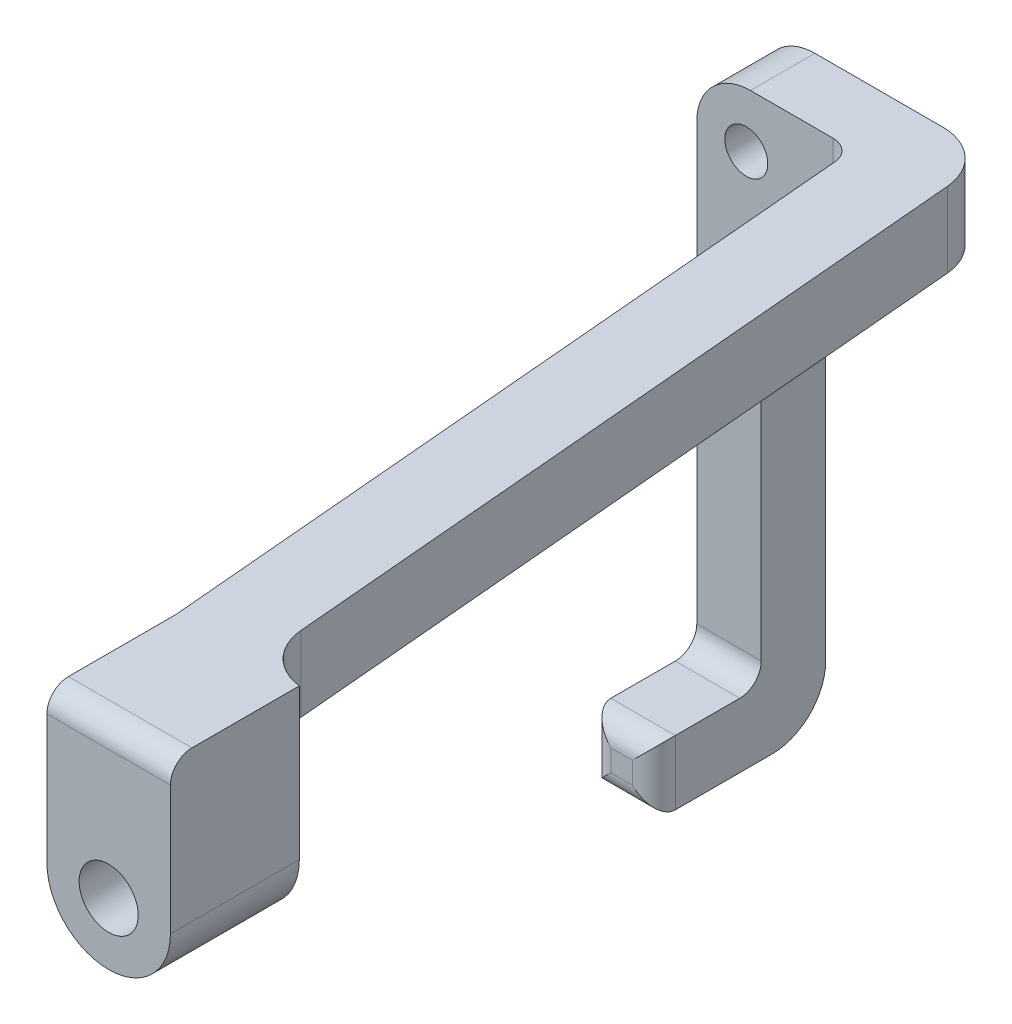
ISO-10303-21;
HEADER;
FILE_DESCRIPTION(('STEP AP214'),'2;1');
FILE_NAME('part.step','',(''),(''),'','','');
FILE_SCHEMA(('AUTOMOTIVE_DESIGN { 1 0 10303 214 1 1 1 1 }'));
ENDSEC;
DATA;
#1=APPLICATION_CONTEXT('core data for automotive mechanical design processes');
#2=APPLICATION_PROTOCOL_DEFINITION('international standard','automotive_design',2000,#1);
#3=PRODUCT_CONTEXT('',#1,'mechanical');
#4=PRODUCT('Part','Part','',(#3));
#5=PRODUCT_RELATED_PRODUCT_CATEGORY('part','',(#4));
#6=PRODUCT_DEFINITION_FORMATION('','',#4);
#7=PRODUCT_DEFINITION_CONTEXT('part definition',#1,'design');
#8=PRODUCT_DEFINITION('design','',#6,#7);
#9=PRODUCT_DEFINITION_SHAPE('','',#8);
#10=(LENGTH_UNIT() NAMED_UNIT(*) SI_UNIT(.MILLI.,.METRE.));
#11=(NAMED_UNIT(*) PLANE_ANGLE_UNIT() SI_UNIT($,.RADIAN.));
#12=(NAMED_UNIT(*) SI_UNIT($,.STERADIAN.) SOLID_ANGLE_UNIT());
#13=UNCERTAINTY_MEASURE_WITH_UNIT(LENGTH_MEASURE(1.E-05),#10,'distance_accuracy_value','');
#14=(GEOMETRIC_REPRESENTATION_CONTEXT(3) GLOBAL_UNCERTAINTY_ASSIGNED_CONTEXT((#13)) GLOBAL_UNIT_ASSIGNED_CONTEXT((#10,
#11,#12)) REPRESENTATION_CONTEXT('',''));
#15=CARTESIAN_POINT('',(0.,0.,0.));
#16=DIRECTION('',(0.,0.,1.));
#17=DIRECTION('',(1.,0.,0.));
#18=AXIS2_PLACEMENT_3D('',#15,#16,#17);
#19=CARTESIAN_POINT('',(-1.37658783702771,7.,-34.5));
#20=DIRECTION('',(0.,0.,-1.));
#21=DIRECTION('',(-1.,0.,0.));
#22=AXIS2_PLACEMENT_3D('',#19,#20,#21);
#23=PLANE('',#22);
#24=CARTESIAN_POINT('',(-10.819543648263,4.44454364826301,-34.5));
#25=DIRECTION('',(0.,0.,-1.));
#26=DIRECTION('',(-1.,0.,0.));
#27=AXIS2_PLACEMENT_3D('',#24,#25,#26);
#28=CIRCLE('',#27,1.);
#29=CARTESIAN_POINT('',(-11.819543648263,4.44454364826301,-34.5));
#30=VERTEX_POINT('',#29);
#31=EDGE_CURVE('E391',#30,#30,#28,.F.);
#32=ORIENTED_EDGE('',*,*,#31,.F.);
#33=EDGE_LOOP('',(#32));
#34=FACE_BOUND('',#33,.T.);
#35=DIRECTION('',(-1.,0.,0.));
#36=VECTOR('',#35,1.);
#37=CARTESIAN_POINT('',(-1.37658783702771,3.5,-34.5));
#38=LINE('',#37,#36);
#39=CARTESIAN_POINT('',(-6.78208186315099,3.5,-34.5));
#40=VERTEX_POINT('',#39);
#41=CARTESIAN_POINT('',(-7.125,3.5,-34.5));
#42=VERTEX_POINT('',#41);
#43=EDGE_CURVE('E216',#40,#42,#38,.T.);
#44=ORIENTED_EDGE('',*,*,#43,.F.);
#45=DIRECTION('',(0.,-1.,0.));
#46=VECTOR('',#45,1.);
#47=CARTESIAN_POINT('',(-6.78208186315099,7.,-34.5));
#48=LINE('',#47,#46);
#49=CARTESIAN_POINT('',(-6.78208186315099,7.,-34.5));
#50=VERTEX_POINT('',#49);
#51=EDGE_CURVE('E394',#40,#50,#48,.F.);
#52=ORIENTED_EDGE('',*,*,#51,.T.);
#53=DIRECTION('',(-1.,0.,0.));
#54=VECTOR('',#53,1.);
#55=CARTESIAN_POINT('',(-1.37658783702771,7.,-34.5));
#56=LINE('',#55,#54);
#57=CARTESIAN_POINT('',(-10.625,7.,-34.5));
#58=VERTEX_POINT('',#57);
#59=EDGE_CURVE('E397',#50,#58,#56,.T.);
#60=ORIENTED_EDGE('',*,*,#59,.T.);
#61=CARTESIAN_POINT('',(-10.625,4.5,-34.5));
#62=DIRECTION('',(0.,0.,-1.));
#63=DIRECTION('',(-1.,0.,0.));
#64=AXIS2_PLACEMENT_3D('',#61,#62,#63);
#65=CIRCLE('',#64,2.5);
#66=CARTESIAN_POINT('',(-13.125,4.5,-34.5));
#67=VERTEX_POINT('',#66);
#68=EDGE_CURVE('E315',#58,#67,#65,.F.);
#69=ORIENTED_EDGE('',*,*,#68,.T.);
#70=DIRECTION('',(0.,-1.,0.));
#71=VECTOR('',#70,1.);
#72=CARTESIAN_POINT('',(-13.125,7.,-34.5));
#73=LINE('',#72,#71);
#74=CARTESIAN_POINT('',(-13.125,-15.75,-34.5));
#75=VERTEX_POINT('',#74);
#76=EDGE_CURVE('E305',#67,#75,#73,.T.);
#77=ORIENTED_EDGE('',*,*,#76,.T.);
#78=DIRECTION('',(-1.,0.,0.));
#79=VECTOR('',#78,1.);
#80=CARTESIAN_POINT('',(-10.125,-15.75,-34.5));
#81=LINE('',#80,#79);
#82=CARTESIAN_POINT('',(-10.125,-15.75,-34.5));
#83=VERTEX_POINT('',#82);
#84=EDGE_CURVE('E406',#75,#83,#81,.F.);
#85=ORIENTED_EDGE('',*,*,#84,.T.);
#86=DIRECTION('',(0.,1.,0.));
#87=VECTOR('',#86,1.);
#88=CARTESIAN_POINT('',(-10.125,-19.75,-34.5));
#89=LINE('',#88,#87);
#90=CARTESIAN_POINT('',(-10.125,0.499999999999994,-34.5));
#91=VERTEX_POINT('',#90);
#92=EDGE_CURVE('E458',#83,#91,#89,.T.);
#93=ORIENTED_EDGE('',*,*,#92,.T.);
#94=CARTESIAN_POINT('',(-7.125,0.500000000000002,-34.5));
#95=DIRECTION('',(0.,0.,-1.));
#96=DIRECTION('',(-1.,0.,0.));
#97=AXIS2_PLACEMENT_3D('',#94,#95,#96);
#98=CIRCLE('',#97,3.);
#99=EDGE_CURVE('E12',#91,#42,#98,.T.);
#100=ORIENTED_EDGE('',*,*,#99,.T.);
#101=EDGE_LOOP('',(#44,#52,#60,#69,#77,#85,#93,#100));
#102=FACE_BOUND('',#101,.T.);
#103=ADVANCED_FACE('F47',(#34,#102),#23,.F.);
#104=CARTESIAN_POINT('',(-2.85356654462041,0.,0.247309100533769));
#105=DIRECTION('',(0.996265469182466,0.,-0.0863430073291471));
#106=DIRECTION('',(-0.0863430073291471,0.,-0.996265469182466));
#107=AXIS2_PLACEMENT_3D('',#104,#105,#106);
#108=PLANE('',#107);
#109=DIRECTION('',(-0.0863430073291471,0.,-0.996265469182466));
#110=VECTOR('',#109,1.);
#111=CARTESIAN_POINT('',(-2.875,7.,0.));
#112=LINE('',#111,#110);
#113=CARTESIAN_POINT('',(-2.875,7.,0.));
#114=VERTEX_POINT('',#113);
#115=CARTESIAN_POINT('',(-5.78581639396853,7.,-33.5863430073291));
#116=VERTEX_POINT('',#115);
#117=EDGE_CURVE('E341',#114,#116,#112,.T.);
#118=ORIENTED_EDGE('',*,*,#117,.T.);
#119=DIRECTION('',(0.,-1.,0.));
#120=VECTOR('',#119,1.);
#121=CARTESIAN_POINT('',(-5.78581639396853,3.5,-33.5863430073291));
#122=LINE('',#121,#120);
#123=CARTESIAN_POINT('',(-5.78581639396853,3.5,-33.5863430073291));
#124=VERTEX_POINT('',#123);
#125=EDGE_CURVE('E411',#116,#124,#122,.T.);
#126=ORIENTED_EDGE('',*,*,#125,.T.);
#127=DIRECTION('',(-0.086343007329147,0.,-0.996265469182466));
#128=VECTOR('',#127,1.);
#129=CARTESIAN_POINT('',(-2.875,3.5,0.));
#130=LINE('',#129,#128);
#131=CARTESIAN_POINT('',(-2.875,3.5,0.));
#132=VERTEX_POINT('',#131);
#133=EDGE_CURVE('E342',#132,#124,#130,.T.);
#134=ORIENTED_EDGE('',*,*,#133,.F.);
#135=DIRECTION('',(0.,1.,0.));
#136=VECTOR('',#135,1.);
#137=CARTESIAN_POINT('',(-2.875,0.,0.));
#138=LINE('',#137,#136);
#139=EDGE_CURVE('E289',#114,#132,#138,.F.);
#140=ORIENTED_EDGE('',*,*,#139,.F.);
#141=EDGE_LOOP('',(#118,#126,#134,#140));
#142=FACE_BOUND('',#141,.T.);
#143=ADVANCED_FACE('F256',(#142),#108,.F.);
#144=CARTESIAN_POINT('',(0.,0.,6.));
#145=DIRECTION('',(0.,0.,1.));
#146=DIRECTION('',(1.,0.,0.));
#147=AXIS2_PLACEMENT_3D('',#144,#145,#146);
#148=PLANE('',#147);
#149=DIRECTION('',(0.,1.,0.));
#150=VECTOR('',#149,1.);
#151=CARTESIAN_POINT('',(2.875,0.,6.));
#152=LINE('',#151,#150);
#153=CARTESIAN_POINT('',(2.875,0.,6.));
#154=VERTEX_POINT('',#153);
#155=CARTESIAN_POINT('',(2.875,6.,6.));
#156=VERTEX_POINT('',#155);
#157=EDGE_CURVE('E491',#154,#156,#152,.T.);
#158=ORIENTED_EDGE('',*,*,#157,.T.);
#159=DIRECTION('',(-1.,0.,0.));
#160=VECTOR('',#159,1.);
#161=CARTESIAN_POINT('',(-2.875,6.,6.));
#162=LINE('',#161,#160);
#163=CARTESIAN_POINT('',(-2.875,6.,6.));
#164=VERTEX_POINT('',#163);
#165=EDGE_CURVE('E405',#156,#164,#162,.T.);
#166=ORIENTED_EDGE('',*,*,#165,.T.);
#167=DIRECTION('',(0.,-1.,0.));
#168=VECTOR('',#167,1.);
#169=CARTESIAN_POINT('',(-2.875,0.,6.));
#170=LINE('',#169,#168);
#171=CARTESIAN_POINT('',(-2.875,0.,6.));
#172=VERTEX_POINT('',#171);
#173=EDGE_CURVE('E481',#164,#172,#170,.T.);
#174=ORIENTED_EDGE('',*,*,#173,.T.);
#175=CARTESIAN_POINT('',(0.,0.,6.));
#176=DIRECTION('',(0.,0.,1.));
#177=DIRECTION('',(1.,0.,0.));
#178=AXIS2_PLACEMENT_3D('',#175,#176,#177);
#179=CIRCLE('',#178,2.875);
#180=EDGE_CURVE('E297',#172,#154,#179,.T.);
#181=ORIENTED_EDGE('',*,*,#180,.T.);
#182=EDGE_LOOP('',(#158,#166,#174,#181));
#183=FACE_BOUND('',#182,.T.);
#184=CARTESIAN_POINT('',(0.,0.,6.));
#185=DIRECTION('',(0.,0.,1.));
#186=DIRECTION('',(1.,0.,0.));
#187=AXIS2_PLACEMENT_3D('',#184,#185,#186);
#188=CIRCLE('',#187,1.375);
#189=CARTESIAN_POINT('',(1.375,0.,6.));
#190=VERTEX_POINT('',#189);
#191=EDGE_CURVE('E243',#190,#190,#188,.T.);
#192=ORIENTED_EDGE('',*,*,#191,.F.);
#193=EDGE_LOOP('',(#192));
#194=FACE_BOUND('',#193,.T.);
#195=ADVANCED_FACE('F263',(#183,#194),#148,.T.);
#196=CARTESIAN_POINT('',(0.,0.,0.));
#197=DIRECTION('',(0.,0.,1.));
#198=DIRECTION('',(1.,0.,0.));
#199=AXIS2_PLACEMENT_3D('',#196,#197,#198);
#200=PLANE('',#199);
#201=DIRECTION('',(-1.,0.,0.));
#202=VECTOR('',#201,1.);
#203=CARTESIAN_POINT('',(-2.875,3.5,0.));
#204=LINE('',#203,#202);
#205=CARTESIAN_POINT('',(2.875,3.5,0.));
#206=VERTEX_POINT('',#205);
#207=EDGE_CURVE('E350',#206,#132,#204,.T.);
#208=ORIENTED_EDGE('',*,*,#207,.F.);
#209=DIRECTION('',(0.,1.,0.));
#210=VECTOR('',#209,1.);
#211=CARTESIAN_POINT('',(2.875,0.,0.));
#212=LINE('',#211,#210);
#213=CARTESIAN_POINT('',(2.875,0.,0.));
#214=VERTEX_POINT('',#213);
#215=EDGE_CURVE('E483',#214,#206,#212,.T.);
#216=ORIENTED_EDGE('',*,*,#215,.F.);
#217=CARTESIAN_POINT('',(0.,0.,0.));
#218=DIRECTION('',(0.,0.,1.));
#219=DIRECTION('',(1.,0.,0.));
#220=AXIS2_PLACEMENT_3D('',#217,#218,#219);
#221=CIRCLE('',#220,2.875);
#222=CARTESIAN_POINT('',(-2.875,0.,0.));
#223=VERTEX_POINT('',#222);
#224=EDGE_CURVE('E487',#223,#214,#221,.T.);
#225=ORIENTED_EDGE('',*,*,#224,.F.);
#226=DIRECTION('',(0.,-1.,0.));
#227=VECTOR('',#226,1.);
#228=CARTESIAN_POINT('',(-2.875,0.,0.));
#229=LINE('',#228,#227);
#230=EDGE_CURVE('E298',#132,#223,#229,.T.);
#231=ORIENTED_EDGE('',*,*,#230,.F.);
#232=EDGE_LOOP('',(#208,#216,#225,#231));
#233=FACE_BOUND('',#232,.T.);
#234=CARTESIAN_POINT('',(0.,0.,0.));
#235=DIRECTION('',(0.,0.,1.));
#236=DIRECTION('',(1.,0.,0.));
#237=AXIS2_PLACEMENT_3D('',#234,#235,#236);
#238=CIRCLE('',#237,1.375);
#239=CARTESIAN_POINT('',(1.375,0.,0.));
#240=VERTEX_POINT('',#239);
#241=EDGE_CURVE('E495',#240,#240,#238,.T.);
#242=ORIENTED_EDGE('',*,*,#241,.T.);
#243=EDGE_LOOP('',(#242));
#244=FACE_BOUND('',#243,.T.);
#245=ADVANCED_FACE('F266',(#233,#244),#200,.F.);
#246=CARTESIAN_POINT('',(0.,0.,6.));
#247=DIRECTION('',(0.,0.,-1.));
#248=DIRECTION('',(-1.,0.,0.));
#249=AXIS2_PLACEMENT_3D('',#246,#247,#248);
#250=CYLINDRICAL_SURFACE('',#249,2.875);
#251=ORIENTED_EDGE('',*,*,#224,.T.);
#252=DIRECTION('',(0.,0.,-1.));
#253=VECTOR('',#252,1.);
#254=CARTESIAN_POINT('',(2.875,0.,6.));
#255=LINE('',#254,#253);
#256=EDGE_CURVE('E310',#154,#214,#255,.T.);
#257=ORIENTED_EDGE('',*,*,#256,.F.);
#258=ORIENTED_EDGE('',*,*,#180,.F.);
#259=DIRECTION('',(0.,0.,-1.));
#260=VECTOR('',#259,1.);
#261=CARTESIAN_POINT('',(-2.875,0.,6.));
#262=LINE('',#261,#260);
#263=EDGE_CURVE('E475',#172,#223,#262,.T.);
#264=ORIENTED_EDGE('',*,*,#263,.T.);
#265=EDGE_LOOP('',(#251,#257,#258,#264));
#266=FACE_BOUND('',#265,.T.);
#267=ADVANCED_FACE('F270',(#266),#250,.T.);
#268=CARTESIAN_POINT('',(2.875,0.,6.));
#269=DIRECTION('',(-1.,0.,0.));
#270=DIRECTION('',(0.,-1.,0.));
#271=AXIS2_PLACEMENT_3D('',#268,#269,#270);
#272=PLANE('',#271);
#273=DIRECTION('',(0.,0.,-1.));
#274=VECTOR('',#273,1.);
#275=CARTESIAN_POINT('',(2.875,7.,6.));
#276=LINE('',#275,#274);
#277=CARTESIAN_POINT('',(2.875,7.,5.));
#278=VERTEX_POINT('',#277);
#279=CARTESIAN_POINT('',(2.875,7.,0.));
#280=VERTEX_POINT('',#279);
#281=EDGE_CURVE('E474',#278,#280,#276,.T.);
#282=ORIENTED_EDGE('',*,*,#281,.F.);
#283=CARTESIAN_POINT('',(2.875,6.,5.));
#284=DIRECTION('',(-1.,0.,0.));
#285=DIRECTION('',(0.,-1.,0.));
#286=AXIS2_PLACEMENT_3D('',#283,#284,#285);
#287=CIRCLE('',#286,1.);
#288=EDGE_CURVE('E418',#278,#156,#287,.F.);
#289=ORIENTED_EDGE('',*,*,#288,.T.);
#290=ORIENTED_EDGE('',*,*,#157,.F.);
#291=ORIENTED_EDGE('',*,*,#256,.T.);
#292=ORIENTED_EDGE('',*,*,#215,.T.);
#293=EDGE_CURVE('E486',#206,#280,#212,.T.);
#294=ORIENTED_EDGE('',*,*,#293,.T.);
#295=EDGE_LOOP('',(#282,#289,#290,#291,#292,#294));
#296=FACE_BOUND('',#295,.T.);
#297=ADVANCED_FACE('F279',(#296),#272,.F.);
#298=CARTESIAN_POINT('',(2.875,7.,6.));
#299=DIRECTION('',(0.,-1.,0.));
#300=DIRECTION('',(0.,0.,-1.));
#301=AXIS2_PLACEMENT_3D('',#298,#299,#300);
#302=PLANE('',#301);
#303=DIRECTION('',(0.,0.,-1.));
#304=VECTOR('',#303,1.);
#305=CARTESIAN_POINT('',(-2.875,7.,6.));
#306=LINE('',#305,#304);
#307=CARTESIAN_POINT('',(-2.875,7.,5.));
#308=VERTEX_POINT('',#307);
#309=EDGE_CURVE('E471',#308,#114,#306,.T.);
#310=ORIENTED_EDGE('',*,*,#309,.F.);
#311=DIRECTION('',(-1.,0.,0.));
#312=VECTOR('',#311,1.);
#313=CARTESIAN_POINT('',(2.875,7.,5.));
#314=LINE('',#313,#312);
#315=EDGE_CURVE('E416',#308,#278,#314,.F.);
#316=ORIENTED_EDGE('',*,*,#315,.T.);
#317=ORIENTED_EDGE('',*,*,#281,.T.);
#318=CARTESIAN_POINT('',(3.16921025672152,7.,-2.48262770564575));
#319=DIRECTION('',(0.,-1.,0.));
#320=DIRECTION('',(0.,0.,-1.));
#321=AXIS2_PLACEMENT_3D('',#318,#319,#320);
#322=CIRCLE('',#321,2.5);
#323=CARTESIAN_POINT('',(0.678546583765352,7.,-2.26677018732288));
#324=VERTEX_POINT('',#323);
#325=EDGE_CURVE('E507',#280,#324,#322,.T.);
#326=ORIENTED_EDGE('',*,*,#325,.T.);
#327=DIRECTION('',(-0.0863430073291471,0.,-0.996265469182466));
#328=VECTOR('',#327,1.);
#329=CARTESIAN_POINT('',(0.875000000000001,7.,0.));
#330=LINE('',#329,#328);
#331=CARTESIAN_POINT('',(-2.17704098492132,7.,-35.2158575183229));
#332=VERTEX_POINT('',#331);
#333=EDGE_CURVE('E227',#324,#332,#330,.T.);
#334=ORIENTED_EDGE('',*,*,#333,.T.);
#335=CARTESIAN_POINT('',(-4.66770465787748,7.,-35.));
#336=DIRECTION('',(0.,-1.,0.));
#337=DIRECTION('',(0.,0.,-1.));
#338=AXIS2_PLACEMENT_3D('',#335,#336,#337);
#339=CIRCLE('',#338,2.5);
#340=CARTESIAN_POINT('',(-4.66770465787748,7.,-37.5));
#341=VERTEX_POINT('',#340);
#342=EDGE_CURVE('E307',#332,#341,#339,.F.);
#343=ORIENTED_EDGE('',*,*,#342,.T.);
#344=DIRECTION('',(1.,0.,0.));
#345=VECTOR('',#344,1.);
#346=CARTESIAN_POINT('',(-2.375,7.,-37.5));
#347=LINE('',#346,#345);
#348=CARTESIAN_POINT('',(-6.125,7.,-37.5));
#349=VERTEX_POINT('',#348);
#350=EDGE_CURVE('E226',#349,#341,#347,.T.);
#351=ORIENTED_EDGE('',*,*,#350,.F.);
#352=DIRECTION('',(1.,0.,0.));
#353=VECTOR('',#352,1.);
#354=CARTESIAN_POINT('',(-13.125,7.,-37.5));
#355=LINE('',#354,#353);
#356=CARTESIAN_POINT('',(-10.625,7.,-37.5));
#357=VERTEX_POINT('',#356);
#358=EDGE_CURVE('E217',#357,#349,#355,.T.);
#359=ORIENTED_EDGE('',*,*,#358,.F.);
#360=DIRECTION('',(0.,0.,1.));
#361=VECTOR('',#360,1.);
#362=CARTESIAN_POINT('',(-10.625,7.,6.));
#363=LINE('',#362,#361);
#364=EDGE_CURVE('E309',#357,#58,#363,.T.);
#365=ORIENTED_EDGE('',*,*,#364,.T.);
#366=ORIENTED_EDGE('',*,*,#59,.F.);
#367=CARTESIAN_POINT('',(-6.78208186315099,7.,-33.5));
#368=DIRECTION('',(0.,-1.,0.));
#369=DIRECTION('',(0.,0.,-1.));
#370=AXIS2_PLACEMENT_3D('',#367,#368,#369);
#371=CIRCLE('',#370,1.);
#372=EDGE_CURVE('E404',#50,#116,#371,.T.);
#373=ORIENTED_EDGE('',*,*,#372,.T.);
#374=ORIENTED_EDGE('',*,*,#117,.F.);
#375=EDGE_LOOP('',(#310,#316,#317,#326,#334,#343,#351,#359,#365,#366,#373,#374));
#376=FACE_BOUND('',#375,.T.);
#377=ADVANCED_FACE('F274',(#376),#302,.F.);
#378=CARTESIAN_POINT('',(-2.875,0.,6.));
#379=DIRECTION('',(1.,0.,0.));
#380=DIRECTION('',(0.,1.,0.));
#381=AXIS2_PLACEMENT_3D('',#378,#379,#380);
#382=PLANE('',#381);
#383=ORIENTED_EDGE('',*,*,#173,.F.);
#384=CARTESIAN_POINT('',(-2.875,6.,5.));
#385=DIRECTION('',(1.,0.,0.));
#386=DIRECTION('',(0.,1.,0.));
#387=AXIS2_PLACEMENT_3D('',#384,#385,#386);
#388=CIRCLE('',#387,1.);
#389=EDGE_CURVE('E409',#164,#308,#388,.F.);
#390=ORIENTED_EDGE('',*,*,#389,.T.);
#391=ORIENTED_EDGE('',*,*,#309,.T.);
#392=ORIENTED_EDGE('',*,*,#139,.T.);
#393=ORIENTED_EDGE('',*,*,#230,.T.);
#394=ORIENTED_EDGE('',*,*,#263,.F.);
#395=EDGE_LOOP('',(#383,#390,#391,#392,#393,#394));
#396=FACE_BOUND('',#395,.T.);
#397=ADVANCED_FACE('F261',(#396),#382,.F.);
#398=CARTESIAN_POINT('',(0.,0.,6.));
#399=DIRECTION('',(0.,0.,-1.));
#400=DIRECTION('',(-1.,0.,0.));
#401=AXIS2_PLACEMENT_3D('',#398,#399,#400);
#402=CYLINDRICAL_SURFACE('',#401,1.375);
#403=ORIENTED_EDGE('',*,*,#191,.T.);
#404=EDGE_LOOP('',(#403));
#405=FACE_BOUND('',#404,.T.);
#406=ORIENTED_EDGE('',*,*,#241,.F.);
#407=EDGE_LOOP('',(#406));
#408=FACE_BOUND('',#407,.T.);
#409=ADVANCED_FACE('F254',(#405,#408),#402,.F.);
#410=CARTESIAN_POINT('',(0.,0.,-37.5));
#411=DIRECTION('',(0.,0.,1.));
#412=DIRECTION('',(1.,0.,0.));
#413=AXIS2_PLACEMENT_3D('',#410,#411,#412);
#414=PLANE('',#413);
#415=CARTESIAN_POINT('',(-10.819543648263,4.44454364826301,-37.5));
#416=DIRECTION('',(0.,0.,-1.));
#417=DIRECTION('',(-1.,0.,0.));
#418=AXIS2_PLACEMENT_3D('',#415,#416,#417);
#419=CIRCLE('',#418,1.);
#420=CARTESIAN_POINT('',(-11.819543648263,4.44454364826301,-37.5));
#421=VERTEX_POINT('',#420);
#422=EDGE_CURVE('E843',#421,#421,#419,.T.);
#423=ORIENTED_EDGE('',*,*,#422,.F.);
#424=EDGE_LOOP('',(#423));
#425=FACE_BOUND('',#424,.T.);
#426=DIRECTION('',(0.,1.,0.));
#427=VECTOR('',#426,1.);
#428=CARTESIAN_POINT('',(-13.125,7.,-37.5));
#429=LINE('',#428,#427);
#430=CARTESIAN_POINT('',(-13.125,-17.25,-37.5));
#431=VERTEX_POINT('',#430);
#432=CARTESIAN_POINT('',(-13.125,4.5,-37.5));
#433=VERTEX_POINT('',#432);
#434=EDGE_CURVE('E461',#431,#433,#429,.T.);
#435=ORIENTED_EDGE('',*,*,#434,.T.);
#436=CARTESIAN_POINT('',(-10.625,4.5,-37.5));
#437=DIRECTION('',(0.,0.,1.));
#438=DIRECTION('',(1.,0.,0.));
#439=AXIS2_PLACEMENT_3D('',#436,#437,#438);
#440=CIRCLE('',#439,2.5);
#441=EDGE_CURVE('E325',#433,#357,#440,.F.);
#442=ORIENTED_EDGE('',*,*,#441,.T.);
#443=ORIENTED_EDGE('',*,*,#358,.T.);
#444=ORIENTED_EDGE('',*,*,#350,.T.);
#445=DIRECTION('',(0.,-1.,0.));
#446=VECTOR('',#445,1.);
#447=CARTESIAN_POINT('',(-4.66770465787748,0.,-37.5));
#448=LINE('',#447,#446);
#449=CARTESIAN_POINT('',(-4.66770465787748,3.5,-37.5));
#450=VERTEX_POINT('',#449);
#451=EDGE_CURVE('E225',#341,#450,#448,.T.);
#452=ORIENTED_EDGE('',*,*,#451,.T.);
#453=DIRECTION('',(-1.,0.,0.));
#454=VECTOR('',#453,1.);
#455=CARTESIAN_POINT('',(-6.125,3.5,-37.5));
#456=LINE('',#455,#454);
#457=CARTESIAN_POINT('',(-6.125,3.5,-37.5));
#458=VERTEX_POINT('',#457);
#459=EDGE_CURVE('E212',#450,#458,#456,.T.);
#460=ORIENTED_EDGE('',*,*,#459,.T.);
#461=DIRECTION('',(1.,0.,0.));
#462=VECTOR('',#461,1.);
#463=CARTESIAN_POINT('',(-13.125,3.5,-37.5));
#464=LINE('',#463,#462);
#465=CARTESIAN_POINT('',(-7.125,3.5,-37.5));
#466=VERTEX_POINT('',#465);
#467=EDGE_CURVE('E208',#466,#458,#464,.T.);
#468=ORIENTED_EDGE('',*,*,#467,.F.);
#469=CARTESIAN_POINT('',(-7.125,0.500000000000002,-37.5));
#470=DIRECTION('',(0.,0.,1.));
#471=DIRECTION('',(1.,0.,0.));
#472=AXIS2_PLACEMENT_3D('',#469,#470,#471);
#473=CIRCLE('',#472,3.);
#474=CARTESIAN_POINT('',(-10.125,0.499999999999997,-37.5));
#475=VERTEX_POINT('',#474);
#476=EDGE_CURVE('E55',#466,#475,#473,.T.);
#477=ORIENTED_EDGE('',*,*,#476,.T.);
#478=DIRECTION('',(0.,1.,0.));
#479=VECTOR('',#478,1.);
#480=CARTESIAN_POINT('',(-10.125,-19.75,-37.5));
#481=LINE('',#480,#479);
#482=CARTESIAN_POINT('',(-10.125,-17.25,-37.5));
#483=VERTEX_POINT('',#482);
#484=EDGE_CURVE('E459',#483,#475,#481,.T.);
#485=ORIENTED_EDGE('',*,*,#484,.F.);
#486=DIRECTION('',(-1.,0.,0.));
#487=VECTOR('',#486,1.);
#488=CARTESIAN_POINT('',(0.,-17.25,-37.5));
#489=LINE('',#488,#487);
#490=EDGE_CURVE('E323',#483,#431,#489,.T.);
#491=ORIENTED_EDGE('',*,*,#490,.T.);
#492=EDGE_LOOP('',(#435,#442,#443,#444,#452,#460,#468,#477,#485,#491));
#493=FACE_BOUND('',#492,.T.);
#494=ADVANCED_FACE('F222',(#425,#493),#414,.F.);
#495=CARTESIAN_POINT('',(0.,3.5,0.));
#496=DIRECTION('',(0.,1.,0.));
#497=DIRECTION('',(-1.,0.,0.));
#498=AXIS2_PLACEMENT_3D('',#495,#496,#497);
#499=PLANE('',#498);
#500=ORIENTED_EDGE('',*,*,#43,.T.);
#501=DIRECTION('',(0.,0.,-1.));
#502=VECTOR('',#501,1.);
#503=CARTESIAN_POINT('',(-7.125,3.5,0.));
#504=LINE('',#503,#502);
#505=EDGE_CURVE('E215',#42,#466,#504,.T.);
#506=ORIENTED_EDGE('',*,*,#505,.T.);
#507=ORIENTED_EDGE('',*,*,#467,.T.);
#508=ORIENTED_EDGE('',*,*,#459,.F.);
#509=CARTESIAN_POINT('',(-4.66770465787748,3.5,-35.));
#510=DIRECTION('',(0.,1.,0.));
#511=DIRECTION('',(-1.,0.,0.));
#512=AXIS2_PLACEMENT_3D('',#509,#510,#511);
#513=CIRCLE('',#512,2.5);
#514=CARTESIAN_POINT('',(-2.17704098492132,3.5,-35.2158575183229));
#515=VERTEX_POINT('',#514);
#516=EDGE_CURVE('E336',#450,#515,#513,.F.);
#517=ORIENTED_EDGE('',*,*,#516,.T.);
#518=DIRECTION('',(-0.086343007329147,0.,-0.996265469182466));
#519=VECTOR('',#518,1.);
#520=CARTESIAN_POINT('',(0.875000000000001,3.5,0.));
#521=LINE('',#520,#519);
#522=CARTESIAN_POINT('',(0.678546583765352,3.5,-2.26677018732288));
#523=VERTEX_POINT('',#522);
#524=EDGE_CURVE('E337',#523,#515,#521,.T.);
#525=ORIENTED_EDGE('',*,*,#524,.F.);
#526=CARTESIAN_POINT('',(3.16921025672152,3.5,-2.48262770564575));
#527=DIRECTION('',(0.,1.,0.));
#528=DIRECTION('',(-1.,0.,0.));
#529=AXIS2_PLACEMENT_3D('',#526,#527,#528);
#530=CIRCLE('',#529,2.5);
#531=EDGE_CURVE('E574',#523,#206,#530,.T.);
#532=ORIENTED_EDGE('',*,*,#531,.T.);
#533=ORIENTED_EDGE('',*,*,#207,.T.);
#534=ORIENTED_EDGE('',*,*,#133,.T.);
#535=CARTESIAN_POINT('',(-6.78208186315099,3.5,-33.5));
#536=DIRECTION('',(0.,1.,0.));
#537=DIRECTION('',(-1.,0.,0.));
#538=AXIS2_PLACEMENT_3D('',#535,#536,#537);
#539=CIRCLE('',#538,1.);
#540=EDGE_CURVE('E402',#124,#40,#539,.T.);
#541=ORIENTED_EDGE('',*,*,#540,.T.);
#542=EDGE_LOOP('',(#500,#506,#507,#508,#517,#525,#532,#533,#534,#541));
#543=FACE_BOUND('',#542,.T.);
#544=ADVANCED_FACE('F211',(#543),#499,.F.);
#545=CARTESIAN_POINT('',(0.86847677444969,0.,-0.0752679871189732));
#546=DIRECTION('',(-0.996265469182466,0.,0.086343007329147));
#547=DIRECTION('',(0.086343007329147,0.,0.996265469182466));
#548=AXIS2_PLACEMENT_3D('',#545,#546,#547);
#549=PLANE('',#548);
#550=ORIENTED_EDGE('',*,*,#524,.T.);
#551=DIRECTION('',(0.,-1.,0.));
#552=VECTOR('',#551,1.);
#553=CARTESIAN_POINT('',(-2.17704098492131,0.,-35.2158575183229));
#554=LINE('',#553,#552);
#555=EDGE_CURVE('E568',#515,#332,#554,.F.);
#556=ORIENTED_EDGE('',*,*,#555,.T.);
#557=ORIENTED_EDGE('',*,*,#333,.F.);
#558=DIRECTION('',(0.,-1.,0.));
#559=VECTOR('',#558,1.);
#560=CARTESIAN_POINT('',(0.678546583765352,0.,-2.26677018732288));
#561=LINE('',#560,#559);
#562=EDGE_CURVE('E570',#324,#523,#561,.T.);
#563=ORIENTED_EDGE('',*,*,#562,.T.);
#564=EDGE_LOOP('',(#550,#556,#557,#563));
#565=FACE_BOUND('',#564,.T.);
#566=ADVANCED_FACE('F371',(#565),#549,.F.);
#567=CARTESIAN_POINT('',(-13.125,0.,0.));
#568=DIRECTION('',(1.,0.,0.));
#569=DIRECTION('',(0.,0.,-1.));
#570=AXIS2_PLACEMENT_3D('',#567,#568,#569);
#571=PLANE('',#570);
#572=DIRECTION('',(0.,0.,1.));
#573=VECTOR('',#572,1.);
#574=CARTESIAN_POINT('',(-13.125,-19.75,0.));
#575=LINE('',#574,#573);
#576=CARTESIAN_POINT('',(-13.125,-19.75,-35.));
#577=VERTEX_POINT('',#576);
#578=CARTESIAN_POINT('',(-13.125,-19.75,-30.5));
#579=VERTEX_POINT('',#578);
#580=EDGE_CURVE('E450',#577,#579,#575,.T.);
#581=ORIENTED_EDGE('',*,*,#580,.T.);
#582=DIRECTION('',(0.,-1.,0.));
#583=VECTOR('',#582,1.);
#584=CARTESIAN_POINT('',(-13.125,0.,-30.5));
#585=LINE('',#584,#583);
#586=CARTESIAN_POINT('',(-13.125,-16.75,-30.5));
#587=VERTEX_POINT('',#586);
#588=EDGE_CURVE('E519',#579,#587,#585,.F.);
#589=ORIENTED_EDGE('',*,*,#588,.T.);
#590=DIRECTION('',(0.,0.,-1.));
#591=VECTOR('',#590,1.);
#592=CARTESIAN_POINT('',(-13.125,-16.75,-29.5));
#593=LINE('',#592,#591);
#594=CARTESIAN_POINT('',(-13.125,-16.75,-33.5));
#595=VERTEX_POINT('',#594);
#596=EDGE_CURVE('E443',#587,#595,#593,.T.);
#597=ORIENTED_EDGE('',*,*,#596,.T.);
#598=CARTESIAN_POINT('',(-13.125,-15.75,-33.5));
#599=DIRECTION('',(1.,0.,0.));
#600=DIRECTION('',(0.,0.,-1.));
#601=AXIS2_PLACEMENT_3D('',#598,#599,#600);
#602=CIRCLE('',#601,1.);
#603=EDGE_CURVE('E422',#595,#75,#602,.T.);
#604=ORIENTED_EDGE('',*,*,#603,.T.);
#605=ORIENTED_EDGE('',*,*,#76,.F.);
#606=DIRECTION('',(0.,0.,1.));
#607=VECTOR('',#606,1.);
#608=CARTESIAN_POINT('',(-13.125,4.5,0.));
#609=LINE('',#608,#607);
#610=EDGE_CURVE('E231',#67,#433,#609,.F.);
#611=ORIENTED_EDGE('',*,*,#610,.T.);
#612=ORIENTED_EDGE('',*,*,#434,.F.);
#613=CARTESIAN_POINT('',(-13.125,-17.25,-35.));
#614=DIRECTION('',(1.,0.,0.));
#615=DIRECTION('',(0.,0.,-1.));
#616=AXIS2_PLACEMENT_3D('',#613,#614,#615);
#617=CIRCLE('',#616,2.5);
#618=EDGE_CURVE('E316',#431,#577,#617,.F.);
#619=ORIENTED_EDGE('',*,*,#618,.T.);
#620=EDGE_LOOP('',(#581,#589,#597,#604,#605,#611,#612,#619));
#621=FACE_BOUND('',#620,.T.);
#622=ADVANCED_FACE('F374',(#621),#571,.F.);
#623=CARTESIAN_POINT('',(-10.125,-19.75,0.));
#624=DIRECTION('',(1.,0.,0.));
#625=DIRECTION('',(0.,0.,-1.));
#626=AXIS2_PLACEMENT_3D('',#623,#624,#625);
#627=PLANE('',#626);
#628=ORIENTED_EDGE('',*,*,#484,.T.);
#629=DIRECTION('',(0.,0.,-1.));
#630=VECTOR('',#629,1.);
#631=CARTESIAN_POINT('',(-10.125,0.5,0.));
#632=LINE('',#631,#630);
#633=EDGE_CURVE('E62',#475,#91,#632,.F.);
#634=ORIENTED_EDGE('',*,*,#633,.T.);
#635=ORIENTED_EDGE('',*,*,#92,.F.);
#636=CARTESIAN_POINT('',(-10.125,-15.75,-33.5));
#637=DIRECTION('',(1.,0.,0.));
#638=DIRECTION('',(0.,0.,-1.));
#639=AXIS2_PLACEMENT_3D('',#636,#637,#638);
#640=CIRCLE('',#639,1.);
#641=CARTESIAN_POINT('',(-10.125,-16.75,-33.5));
#642=VERTEX_POINT('',#641);
#643=EDGE_CURVE('E424',#83,#642,#640,.F.);
#644=ORIENTED_EDGE('',*,*,#643,.T.);
#645=DIRECTION('',(0.,0.,-1.));
#646=VECTOR('',#645,1.);
#647=CARTESIAN_POINT('',(-10.125,-16.75,-29.5));
#648=LINE('',#647,#646);
#649=CARTESIAN_POINT('',(-10.125,-16.75,-30.5));
#650=VERTEX_POINT('',#649);
#651=EDGE_CURVE('E435',#650,#642,#648,.T.);
#652=ORIENTED_EDGE('',*,*,#651,.F.);
#653=DIRECTION('',(0.,1.,0.));
#654=VECTOR('',#653,1.);
#655=CARTESIAN_POINT('',(-10.125,-19.75,-30.5));
#656=LINE('',#655,#654);
#657=CARTESIAN_POINT('',(-10.125,-19.75,-30.5));
#658=VERTEX_POINT('',#657);
#659=EDGE_CURVE('E514',#650,#658,#656,.F.);
#660=ORIENTED_EDGE('',*,*,#659,.T.);
#661=DIRECTION('',(0.,0.,-1.));
#662=VECTOR('',#661,1.);
#663=CARTESIAN_POINT('',(-10.125,-19.75,0.));
#664=LINE('',#663,#662);
#665=CARTESIAN_POINT('',(-10.125,-19.75,-35.));
#666=VERTEX_POINT('',#665);
#667=EDGE_CURVE('E456',#658,#666,#664,.T.);
#668=ORIENTED_EDGE('',*,*,#667,.T.);
#669=CARTESIAN_POINT('',(-10.125,-17.25,-35.));
#670=DIRECTION('',(1.,0.,0.));
#671=DIRECTION('',(0.,0.,-1.));
#672=AXIS2_PLACEMENT_3D('',#669,#670,#671);
#673=CIRCLE('',#672,2.5);
#674=EDGE_CURVE('E334',#666,#483,#673,.T.);
#675=ORIENTED_EDGE('',*,*,#674,.T.);
#676=EDGE_LOOP('',(#628,#634,#635,#644,#652,#660,#668,#675));
#677=FACE_BOUND('',#676,.T.);
#678=ADVANCED_FACE('F380',(#677),#627,.T.);
#679=CARTESIAN_POINT('',(0.,-19.75,0.));
#680=DIRECTION('',(0.,1.,0.));
#681=DIRECTION('',(-1.,0.,0.));
#682=AXIS2_PLACEMENT_3D('',#679,#680,#681);
#683=PLANE('',#682);
#684=ORIENTED_EDGE('',*,*,#667,.F.);
#685=DIRECTION('',(1.,0.,0.));
#686=VECTOR('',#685,1.);
#687=CARTESIAN_POINT('',(0.,-19.75,-30.5));
#688=LINE('',#687,#686);
#689=EDGE_CURVE('E517',#658,#579,#688,.F.);
#690=ORIENTED_EDGE('',*,*,#689,.T.);
#691=ORIENTED_EDGE('',*,*,#580,.F.);
#692=DIRECTION('',(-1.,0.,0.));
#693=VECTOR('',#692,1.);
#694=CARTESIAN_POINT('',(0.,-19.75,-35.));
#695=LINE('',#694,#693);
#696=EDGE_CURVE('E331',#577,#666,#695,.F.);
#697=ORIENTED_EDGE('',*,*,#696,.T.);
#698=EDGE_LOOP('',(#684,#690,#691,#697));
#699=FACE_BOUND('',#698,.T.);
#700=ADVANCED_FACE('F556',(#699),#683,.F.);
#701=CARTESIAN_POINT('',(-13.125,-16.75,-29.5));
#702=DIRECTION('',(0.,-1.,0.));
#703=DIRECTION('',(0.,0.,-1.));
#704=AXIS2_PLACEMENT_3D('',#701,#702,#703);
#705=PLANE('',#704);
#706=ORIENTED_EDGE('',*,*,#596,.F.);
#707=DIRECTION('',(-1.,0.,0.));
#708=VECTOR('',#707,1.);
#709=CARTESIAN_POINT('',(-13.125,-16.75,-30.5));
#710=LINE('',#709,#708);
#711=EDGE_CURVE('E523',#587,#650,#710,.F.);
#712=ORIENTED_EDGE('',*,*,#711,.T.);
#713=ORIENTED_EDGE('',*,*,#651,.T.);
#714=DIRECTION('',(-1.,0.,0.));
#715=VECTOR('',#714,1.);
#716=CARTESIAN_POINT('',(-13.125,-16.75,-33.5));
#717=LINE('',#716,#715);
#718=EDGE_CURVE('E521',#642,#595,#717,.T.);
#719=ORIENTED_EDGE('',*,*,#718,.T.);
#720=EDGE_LOOP('',(#706,#712,#713,#719));
#721=FACE_BOUND('',#720,.T.);
#722=ADVANCED_FACE('F538',(#721),#705,.F.);
#723=CARTESIAN_POINT('',(0.,0.,-29.5));
#724=DIRECTION('',(0.,0.,-1.));
#725=DIRECTION('',(-1.,0.,0.));
#726=AXIS2_PLACEMENT_3D('',#723,#724,#725);
#727=PLANE('',#726);
#728=DIRECTION('',(1.,0.,0.));
#729=VECTOR('',#728,1.);
#730=CARTESIAN_POINT('',(0.,-18.75,-29.5));
#731=LINE('',#730,#729);
#732=CARTESIAN_POINT('',(-12.125,-18.75,-29.5));
#733=VERTEX_POINT('',#732);
#734=CARTESIAN_POINT('',(-11.125,-18.75,-29.5));
#735=VERTEX_POINT('',#734);
#736=EDGE_CURVE('E509',#733,#735,#731,.T.);
#737=ORIENTED_EDGE('',*,*,#736,.T.);
#738=DIRECTION('',(0.,1.,0.));
#739=VECTOR('',#738,1.);
#740=CARTESIAN_POINT('',(-11.125,-16.75,-29.5));
#741=LINE('',#740,#739);
#742=CARTESIAN_POINT('',(-11.125,-17.75,-29.5));
#743=VERTEX_POINT('',#742);
#744=EDGE_CURVE('E511',#735,#743,#741,.T.);
#745=ORIENTED_EDGE('',*,*,#744,.T.);
#746=DIRECTION('',(-1.,0.,0.));
#747=VECTOR('',#746,1.);
#748=CARTESIAN_POINT('',(0.,-17.75,-29.5));
#749=LINE('',#748,#747);
#750=CARTESIAN_POINT('',(-12.125,-17.75,-29.5));
#751=VERTEX_POINT('',#750);
#752=EDGE_CURVE('E503',#743,#751,#749,.T.);
#753=ORIENTED_EDGE('',*,*,#752,.T.);
#754=DIRECTION('',(0.,-1.,0.));
#755=VECTOR('',#754,1.);
#756=CARTESIAN_POINT('',(-12.125,0.,-29.5));
#757=LINE('',#756,#755);
#758=EDGE_CURVE('E506',#751,#733,#757,.T.);
#759=ORIENTED_EDGE('',*,*,#758,.T.);
#760=EDGE_LOOP('',(#737,#745,#753,#759));
#761=FACE_BOUND('',#760,.T.);
#762=ADVANCED_FACE('F602',(#761),#727,.F.);
#763=CARTESIAN_POINT('',(-10.625,4.5,6.));
#764=DIRECTION('',(0.,0.,1.));
#765=DIRECTION('',(1.,0.,0.));
#766=AXIS2_PLACEMENT_3D('',#763,#764,#765);
#767=CYLINDRICAL_SURFACE('',#766,2.5);
#768=ORIENTED_EDGE('',*,*,#441,.F.);
#769=ORIENTED_EDGE('',*,*,#610,.F.);
#770=ORIENTED_EDGE('',*,*,#68,.F.);
#771=ORIENTED_EDGE('',*,*,#364,.F.);
#772=EDGE_LOOP('',(#768,#769,#770,#771));
#773=FACE_BOUND('',#772,.T.);
#774=ADVANCED_FACE('F532',(#773),#767,.T.);
#775=CARTESIAN_POINT('',(0.,-17.25,-35.));
#776=DIRECTION('',(-1.,0.,0.));
#777=DIRECTION('',(0.,-1.,0.));
#778=AXIS2_PLACEMENT_3D('',#775,#776,#777);
#779=CYLINDRICAL_SURFACE('',#778,2.5);
#780=ORIENTED_EDGE('',*,*,#674,.F.);
#781=ORIENTED_EDGE('',*,*,#696,.F.);
#782=ORIENTED_EDGE('',*,*,#618,.F.);
#783=ORIENTED_EDGE('',*,*,#490,.F.);
#784=EDGE_LOOP('',(#780,#781,#782,#783));
#785=FACE_BOUND('',#784,.T.);
#786=ADVANCED_FACE('F561',(#785),#779,.T.);
#787=CARTESIAN_POINT('',(-4.66770465787748,0.,-35.));
#788=DIRECTION('',(0.,-1.,0.));
#789=DIRECTION('',(0.,0.,-1.));
#790=AXIS2_PLACEMENT_3D('',#787,#788,#789);
#791=CYLINDRICAL_SURFACE('',#790,2.5);
#792=ORIENTED_EDGE('',*,*,#342,.F.);
#793=ORIENTED_EDGE('',*,*,#555,.F.);
#794=ORIENTED_EDGE('',*,*,#516,.F.);
#795=ORIENTED_EDGE('',*,*,#451,.F.);
#796=EDGE_LOOP('',(#792,#793,#794,#795));
#797=FACE_BOUND('',#796,.T.);
#798=ADVANCED_FACE('F567',(#797),#791,.T.);
#799=CARTESIAN_POINT('',(3.16921025672152,0.,-2.48262770564575));
#800=DIRECTION('',(0.,-1.,0.));
#801=DIRECTION('',(1.,0.,0.));
#802=AXIS2_PLACEMENT_3D('',#799,#800,#801);
#803=CYLINDRICAL_SURFACE('',#802,2.5);
#804=ORIENTED_EDGE('',*,*,#325,.F.);
#805=ORIENTED_EDGE('',*,*,#293,.F.);
#806=ORIENTED_EDGE('',*,*,#531,.F.);
#807=ORIENTED_EDGE('',*,*,#562,.F.);
#808=EDGE_LOOP('',(#804,#805,#806,#807));
#809=FACE_BOUND('',#808,.T.);
#810=ADVANCED_FACE('F583',(#809),#803,.F.);
#811=CARTESIAN_POINT('',(-12.125,0.,-30.5));
#812=DIRECTION('',(0.,-1.,0.));
#813=DIRECTION('',(0.,0.,-1.));
#814=AXIS2_PLACEMENT_3D('',#811,#812,#813);
#815=CYLINDRICAL_SURFACE('',#814,1.);
#816=CARTESIAN_POINT('',(-12.125,-17.75,-30.5));
#817=DIRECTION('',(-0.707106781186547,-0.707106781186547,0.));
#818=DIRECTION('',(-0.707106781186547,0.707106781186547,0.));
#819=AXIS2_PLACEMENT_3D('',#816,#817,#818);
#820=ELLIPSE('',#819,1.41421356237309,1.);
#821=EDGE_CURVE('E430',#587,#751,#820,.F.);
#822=ORIENTED_EDGE('',*,*,#821,.F.);
#823=ORIENTED_EDGE('',*,*,#588,.F.);
#824=CARTESIAN_POINT('',(-12.125,-18.75,-30.5));
#825=DIRECTION('',(0.707106781186547,-0.707106781186548,0.));
#826=DIRECTION('',(-0.707106781186548,-0.707106781186547,0.));
#827=AXIS2_PLACEMENT_3D('',#824,#825,#826);
#828=ELLIPSE('',#827,1.41421356237309,1.);
#829=EDGE_CURVE('E433',#733,#579,#828,.T.);
#830=ORIENTED_EDGE('',*,*,#829,.F.);
#831=ORIENTED_EDGE('',*,*,#758,.F.);
#832=EDGE_LOOP('',(#822,#823,#830,#831));
#833=FACE_BOUND('',#832,.T.);
#834=ADVANCED_FACE('F544',(#833),#815,.T.);
#835=CARTESIAN_POINT('',(0.,-18.75,-30.5));
#836=DIRECTION('',(1.,0.,0.));
#837=DIRECTION('',(0.,1.,0.));
#838=AXIS2_PLACEMENT_3D('',#835,#836,#837);
#839=CYLINDRICAL_SURFACE('',#838,1.);
#840=ORIENTED_EDGE('',*,*,#829,.T.);
#841=ORIENTED_EDGE('',*,*,#689,.F.);
#842=CARTESIAN_POINT('',(-11.125,-18.75,-30.5));
#843=DIRECTION('',(0.707106781186548,0.707106781186547,0.));
#844=DIRECTION('',(0.707106781186547,-0.707106781186548,0.));
#845=AXIS2_PLACEMENT_3D('',#842,#843,#844);
#846=ELLIPSE('',#845,1.4142135623731,1.);
#847=EDGE_CURVE('E428',#735,#658,#846,.T.);
#848=ORIENTED_EDGE('',*,*,#847,.F.);
#849=ORIENTED_EDGE('',*,*,#736,.F.);
#850=EDGE_LOOP('',(#840,#841,#848,#849));
#851=FACE_BOUND('',#850,.T.);
#852=ADVANCED_FACE('F613',(#851),#839,.T.);
#853=CARTESIAN_POINT('',(0.,-17.75,-30.5));
#854=DIRECTION('',(-1.,0.,0.));
#855=DIRECTION('',(0.,0.,1.));
#856=AXIS2_PLACEMENT_3D('',#853,#854,#855);
#857=CYLINDRICAL_SURFACE('',#856,1.);
#858=ORIENTED_EDGE('',*,*,#821,.T.);
#859=ORIENTED_EDGE('',*,*,#752,.F.);
#860=CARTESIAN_POINT('',(-11.125,-17.75,-30.5));
#861=DIRECTION('',(-0.707106781186547,0.707106781186547,0.));
#862=DIRECTION('',(-0.707106781186547,-0.707106781186547,0.));
#863=AXIS2_PLACEMENT_3D('',#860,#861,#862);
#864=ELLIPSE('',#863,1.41421356237309,1.);
#865=EDGE_CURVE('E426',#650,#743,#864,.F.);
#866=ORIENTED_EDGE('',*,*,#865,.F.);
#867=ORIENTED_EDGE('',*,*,#711,.F.);
#868=EDGE_LOOP('',(#858,#859,#866,#867));
#869=FACE_BOUND('',#868,.T.);
#870=ADVANCED_FACE('F548',(#869),#857,.T.);
#871=CARTESIAN_POINT('',(-11.125,0.,-30.5));
#872=DIRECTION('',(0.,-1.,0.));
#873=DIRECTION('',(0.,0.,-1.));
#874=AXIS2_PLACEMENT_3D('',#871,#872,#873);
#875=CYLINDRICAL_SURFACE('',#874,1.);
#876=ORIENTED_EDGE('',*,*,#847,.T.);
#877=ORIENTED_EDGE('',*,*,#659,.F.);
#878=ORIENTED_EDGE('',*,*,#865,.T.);
#879=ORIENTED_EDGE('',*,*,#744,.F.);
#880=EDGE_LOOP('',(#876,#877,#878,#879));
#881=FACE_BOUND('',#880,.T.);
#882=ADVANCED_FACE('F552',(#881),#875,.T.);
#883=CARTESIAN_POINT('',(-6.78208186315099,0.,-33.5));
#884=DIRECTION('',(0.,1.,0.));
#885=DIRECTION('',(0.,0.,1.));
#886=AXIS2_PLACEMENT_3D('',#883,#884,#885);
#887=CYLINDRICAL_SURFACE('',#886,1.);
#888=ORIENTED_EDGE('',*,*,#372,.F.);
#889=ORIENTED_EDGE('',*,*,#51,.F.);
#890=ORIENTED_EDGE('',*,*,#540,.F.);
#891=ORIENTED_EDGE('',*,*,#125,.F.);
#892=EDGE_LOOP('',(#888,#889,#890,#891));
#893=FACE_BOUND('',#892,.T.);
#894=ADVANCED_FACE('F400',(#893),#887,.F.);
#895=CARTESIAN_POINT('',(-13.125,-15.75,-33.5));
#896=DIRECTION('',(1.,0.,0.));
#897=DIRECTION('',(0.,0.,-1.));
#898=AXIS2_PLACEMENT_3D('',#895,#896,#897);
#899=CYLINDRICAL_SURFACE('',#898,1.);
#900=ORIENTED_EDGE('',*,*,#643,.F.);
#901=ORIENTED_EDGE('',*,*,#84,.F.);
#902=ORIENTED_EDGE('',*,*,#603,.F.);
#903=ORIENTED_EDGE('',*,*,#718,.F.);
#904=EDGE_LOOP('',(#900,#901,#902,#903));
#905=FACE_BOUND('',#904,.T.);
#906=ADVANCED_FACE('F537',(#905),#899,.F.);
#907=CARTESIAN_POINT('',(0.,6.,5.));
#908=DIRECTION('',(1.,0.,0.));
#909=DIRECTION('',(0.,0.,-1.));
#910=AXIS2_PLACEMENT_3D('',#907,#908,#909);
#911=CYLINDRICAL_SURFACE('',#910,1.);
#912=ORIENTED_EDGE('',*,*,#288,.F.);
#913=ORIENTED_EDGE('',*,*,#315,.F.);
#914=ORIENTED_EDGE('',*,*,#389,.F.);
#915=ORIENTED_EDGE('',*,*,#165,.F.);
#916=EDGE_LOOP('',(#912,#913,#914,#915));
#917=FACE_BOUND('',#916,.T.);
#918=ADVANCED_FACE('F592',(#917),#911,.T.);
#919=CARTESIAN_POINT('',(-7.125,0.500000000000001,0.));
#920=DIRECTION('',(0.,0.,-1.));
#921=DIRECTION('',(0.,1.,0.));
#922=AXIS2_PLACEMENT_3D('',#919,#920,#921);
#923=CYLINDRICAL_SURFACE('',#922,3.);
#924=ORIENTED_EDGE('',*,*,#99,.F.);
#925=ORIENTED_EDGE('',*,*,#633,.F.);
#926=ORIENTED_EDGE('',*,*,#476,.F.);
#927=ORIENTED_EDGE('',*,*,#505,.F.);
#928=EDGE_LOOP('',(#924,#925,#926,#927));
#929=FACE_BOUND('',#928,.T.);
#930=ADVANCED_FACE('F49',(#929),#923,.F.);
#931=CARTESIAN_POINT('',(-10.819543648263,4.44454364826301,6.001));
#932=DIRECTION('',(0.,0.,-1.));
#933=DIRECTION('',(-1.,0.,0.));
#934=AXIS2_PLACEMENT_3D('',#931,#932,#933);
#935=CYLINDRICAL_SURFACE('',#934,1.);
#936=ORIENTED_EDGE('',*,*,#422,.T.);
#937=EDGE_LOOP('',(#936));
#938=FACE_BOUND('',#937,.T.);
#939=ORIENTED_EDGE('',*,*,#31,.T.);
#940=EDGE_LOOP('',(#939));
#941=FACE_BOUND('',#940,.T.);
#942=ADVANCED_FACE('F624',(#938,#941),#935,.F.);
#943=CLOSED_SHELL('',(#103,#143,#195,#245,#267,#297,#377,#397,#409,#494,#544,#566,#622,#678,
#700,#722,#762,#774,#786,#798,#810,#834,#852,#870,#882,#894,#906,#918,#930,#942));
#944=MANIFOLD_SOLID_BREP('B2',#943);
#945=ADVANCED_BREP_SHAPE_REPRESENTATION('',(#18,#944),#14);
#946=SHAPE_DEFINITION_REPRESENTATION(#9,#945);
ENDSEC;
END-ISO-10303-21;
